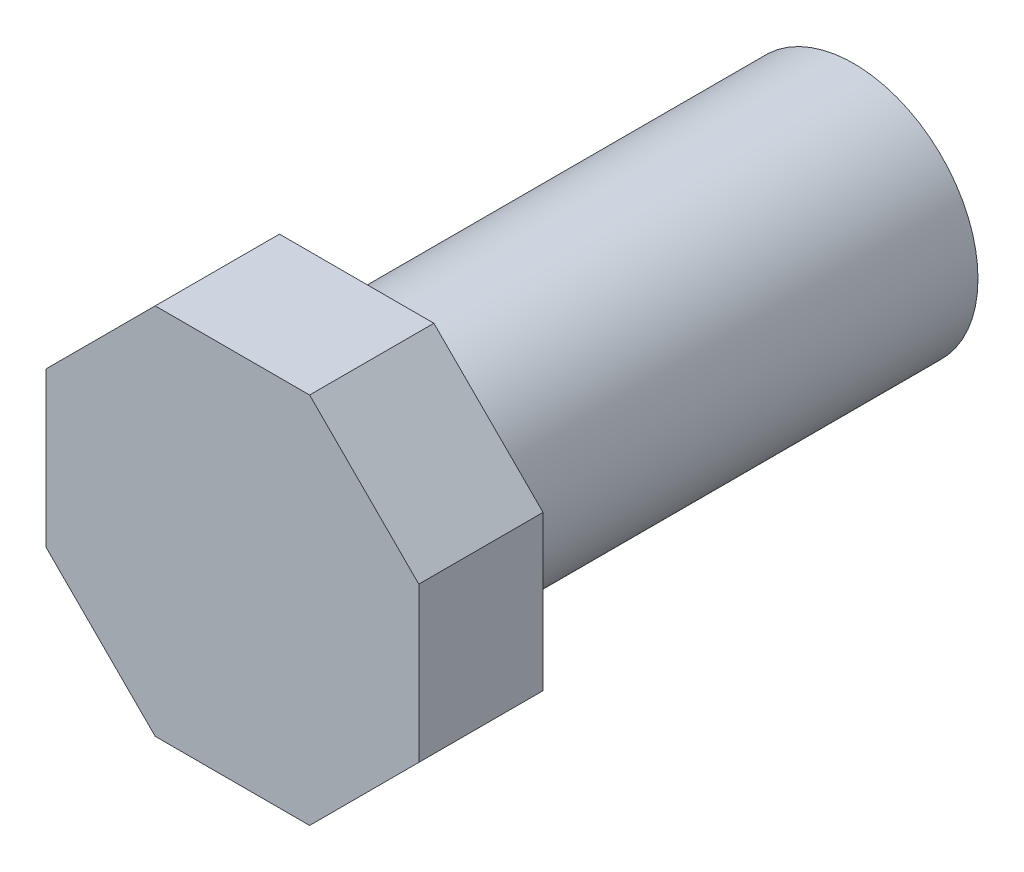
ISO-10303-21;
HEADER;
FILE_DESCRIPTION(('STEP AP214'),'2;1');
FILE_NAME('part.step','',(''),(''),'','','');
FILE_SCHEMA(('AUTOMOTIVE_DESIGN { 1 0 10303 214 1 1 1 1 }'));
ENDSEC;
DATA;
#1=APPLICATION_CONTEXT('core data for automotive mechanical design processes');
#2=APPLICATION_PROTOCOL_DEFINITION('international standard','automotive_design',2000,#1);
#3=PRODUCT_CONTEXT('',#1,'mechanical');
#4=PRODUCT('Part','Part','',(#3));
#5=PRODUCT_RELATED_PRODUCT_CATEGORY('part','',(#4));
#6=PRODUCT_DEFINITION_FORMATION('','',#4);
#7=PRODUCT_DEFINITION_CONTEXT('part definition',#1,'design');
#8=PRODUCT_DEFINITION('design','',#6,#7);
#9=PRODUCT_DEFINITION_SHAPE('','',#8);
#10=(LENGTH_UNIT() NAMED_UNIT(*) SI_UNIT(.MILLI.,.METRE.));
#11=(NAMED_UNIT(*) PLANE_ANGLE_UNIT() SI_UNIT($,.RADIAN.));
#12=(NAMED_UNIT(*) SI_UNIT($,.STERADIAN.) SOLID_ANGLE_UNIT());
#13=UNCERTAINTY_MEASURE_WITH_UNIT(LENGTH_MEASURE(1.E-05),#10,'distance_accuracy_value','');
#14=(GEOMETRIC_REPRESENTATION_CONTEXT(3) GLOBAL_UNCERTAINTY_ASSIGNED_CONTEXT((#13)) GLOBAL_UNIT_ASSIGNED_CONTEXT((#10,
#11,#12)) REPRESENTATION_CONTEXT('',''));
#15=CARTESIAN_POINT('',(0.,0.,0.));
#16=DIRECTION('',(0.,0.,1.));
#17=DIRECTION('',(1.,0.,0.));
#18=AXIS2_PLACEMENT_3D('',#15,#16,#17);
#19=CARTESIAN_POINT('',(0.,0.,25.4));
#20=DIRECTION('',(0.,0.,-1.));
#21=DIRECTION('',(-1.,0.,0.));
#22=AXIS2_PLACEMENT_3D('',#19,#20,#21);
#23=CYLINDRICAL_SURFACE('',#22,6.35);
#24=CARTESIAN_POINT('',(0.,0.,25.4));
#25=DIRECTION('',(0.,0.,1.));
#26=DIRECTION('',(1.,0.,0.));
#27=AXIS2_PLACEMENT_3D('',#24,#25,#26);
#28=CIRCLE('',#27,6.35);
#29=CARTESIAN_POINT('',(6.35,0.,25.4));
#30=VERTEX_POINT('',#29);
#31=EDGE_CURVE('E11',#30,#30,#28,.T.);
#32=ORIENTED_EDGE('',*,*,#31,.F.);
#33=EDGE_LOOP('',(#32));
#34=FACE_BOUND('',#33,.T.);
#35=CARTESIAN_POINT('',(0.,0.,0.));
#36=DIRECTION('',(0.,0.,1.));
#37=DIRECTION('',(1.,0.,0.));
#38=AXIS2_PLACEMENT_3D('',#35,#36,#37);
#39=CIRCLE('',#38,6.35);
#40=CARTESIAN_POINT('',(6.35,0.,0.));
#41=VERTEX_POINT('',#40);
#42=EDGE_CURVE('E34',#41,#41,#39,.T.);
#43=ORIENTED_EDGE('',*,*,#42,.T.);
#44=EDGE_LOOP('',(#43));
#45=FACE_BOUND('',#44,.T.);
#46=ADVANCED_FACE('F31',(#34,#45),#23,.T.);
#47=CARTESIAN_POINT('',(0.,0.,0.));
#48=DIRECTION('',(0.,0.,1.));
#49=DIRECTION('',(1.,0.,0.));
#50=AXIS2_PLACEMENT_3D('',#47,#48,#49);
#51=PLANE('',#50);
#52=ORIENTED_EDGE('',*,*,#42,.F.);
#53=EDGE_LOOP('',(#52));
#54=FACE_BOUND('',#53,.T.);
#55=ADVANCED_FACE('F161',(#54),#51,.F.);
#56=CARTESIAN_POINT('',(9.525,9.525,25.4));
#57=DIRECTION('',(0.,0.,1.));
#58=DIRECTION('',(1.,0.,0.));
#59=AXIS2_PLACEMENT_3D('',#56,#57,#58);
#60=PLANE('',#59);
#61=DIRECTION('',(0.,1.,0.));
#62=VECTOR('',#61,1.);
#63=CARTESIAN_POINT('',(9.525,-3.94538418160373,25.4));
#64=LINE('',#63,#62);
#65=CARTESIAN_POINT('',(9.525,-3.94538418160373,25.4));
#66=VERTEX_POINT('',#65);
#67=CARTESIAN_POINT('',(9.525,3.94538418160373,25.4));
#68=VERTEX_POINT('',#67);
#69=EDGE_CURVE('E128',#66,#68,#64,.T.);
#70=ORIENTED_EDGE('',*,*,#69,.F.);
#71=DIRECTION('',(0.707106781186548,0.707106781186547,0.));
#72=VECTOR('',#71,1.);
#73=CARTESIAN_POINT('',(3.94538418160373,-9.525,25.4));
#74=LINE('',#73,#72);
#75=CARTESIAN_POINT('',(3.94538418160373,-9.525,25.4));
#76=VERTEX_POINT('',#75);
#77=EDGE_CURVE('E82',#76,#66,#74,.T.);
#78=ORIENTED_EDGE('',*,*,#77,.F.);
#79=DIRECTION('',(1.,0.,0.));
#80=VECTOR('',#79,1.);
#81=CARTESIAN_POINT('',(-3.94538418160373,-9.525,25.4));
#82=LINE('',#81,#80);
#83=CARTESIAN_POINT('',(-3.94538418160373,-9.525,25.4));
#84=VERTEX_POINT('',#83);
#85=EDGE_CURVE('E76',#84,#76,#82,.T.);
#86=ORIENTED_EDGE('',*,*,#85,.F.);
#87=DIRECTION('',(0.707106781186548,-0.707106781186547,0.));
#88=VECTOR('',#87,1.);
#89=CARTESIAN_POINT('',(-9.525,-3.94538418160373,25.4));
#90=LINE('',#89,#88);
#91=CARTESIAN_POINT('',(-9.525,-3.94538418160373,25.4));
#92=VERTEX_POINT('',#91);
#93=EDGE_CURVE('E118',#92,#84,#90,.T.);
#94=ORIENTED_EDGE('',*,*,#93,.F.);
#95=DIRECTION('',(0.,-1.,0.));
#96=VECTOR('',#95,1.);
#97=CARTESIAN_POINT('',(-9.525,3.94538418160373,25.4));
#98=LINE('',#97,#96);
#99=CARTESIAN_POINT('',(-9.525,3.94538418160373,25.4));
#100=VERTEX_POINT('',#99);
#101=EDGE_CURVE('E137',#100,#92,#98,.T.);
#102=ORIENTED_EDGE('',*,*,#101,.F.);
#103=DIRECTION('',(-0.707106781186547,-0.707106781186548,0.));
#104=VECTOR('',#103,1.);
#105=CARTESIAN_POINT('',(-3.94538418160373,9.525,25.4));
#106=LINE('',#105,#104);
#107=CARTESIAN_POINT('',(-3.94538418160373,9.525,25.4));
#108=VERTEX_POINT('',#107);
#109=EDGE_CURVE('E135',#108,#100,#106,.T.);
#110=ORIENTED_EDGE('',*,*,#109,.F.);
#111=DIRECTION('',(-1.,0.,0.));
#112=VECTOR('',#111,1.);
#113=CARTESIAN_POINT('',(3.94538418160373,9.525,25.4));
#114=LINE('',#113,#112);
#115=CARTESIAN_POINT('',(3.94538418160373,9.525,25.4));
#116=VERTEX_POINT('',#115);
#117=EDGE_CURVE('E133',#116,#108,#114,.T.);
#118=ORIENTED_EDGE('',*,*,#117,.F.);
#119=DIRECTION('',(-0.707106781186548,0.707106781186547,0.));
#120=VECTOR('',#119,1.);
#121=CARTESIAN_POINT('',(9.525,3.94538418160373,25.4));
#122=LINE('',#121,#120);
#123=EDGE_CURVE('E131',#68,#116,#122,.T.);
#124=ORIENTED_EDGE('',*,*,#123,.F.);
#125=EDGE_LOOP('',(#70,#78,#86,#94,#102,#110,#118,#124));
#126=FACE_BOUND('',#125,.T.);
#127=ORIENTED_EDGE('',*,*,#31,.T.);
#128=EDGE_LOOP('',(#127));
#129=FACE_BOUND('',#128,.T.);
#130=ADVANCED_FACE('F163',(#126,#129),#60,.F.);
#131=CARTESIAN_POINT('',(9.525,-3.94538418160373,31.75));
#132=DIRECTION('',(-1.,0.,0.));
#133=DIRECTION('',(0.,0.,1.));
#134=AXIS2_PLACEMENT_3D('',#131,#132,#133);
#135=PLANE('',#134);
#136=ORIENTED_EDGE('',*,*,#69,.T.);
#137=DIRECTION('',(0.,0.,-1.));
#138=VECTOR('',#137,1.);
#139=CARTESIAN_POINT('',(9.525,3.94538418160373,31.75));
#140=LINE('',#139,#138);
#141=CARTESIAN_POINT('',(9.525,3.94538418160373,31.75));
#142=VERTEX_POINT('',#141);
#143=EDGE_CURVE('E155',#142,#68,#140,.T.);
#144=ORIENTED_EDGE('',*,*,#143,.F.);
#145=DIRECTION('',(0.,1.,0.));
#146=VECTOR('',#145,1.);
#147=CARTESIAN_POINT('',(9.525,-3.94538418160373,31.75));
#148=LINE('',#147,#146);
#149=CARTESIAN_POINT('',(9.525,-3.94538418160373,31.75));
#150=VERTEX_POINT('',#149);
#151=EDGE_CURVE('E142',#150,#142,#148,.T.);
#152=ORIENTED_EDGE('',*,*,#151,.F.);
#153=DIRECTION('',(0.,0.,-1.));
#154=VECTOR('',#153,1.);
#155=CARTESIAN_POINT('',(9.525,-3.94538418160373,31.75));
#156=LINE('',#155,#154);
#157=EDGE_CURVE('E124',#150,#66,#156,.T.);
#158=ORIENTED_EDGE('',*,*,#157,.T.);
#159=EDGE_LOOP('',(#136,#144,#152,#158));
#160=FACE_BOUND('',#159,.T.);
#161=ADVANCED_FACE('F168',(#160),#135,.F.);
#162=CARTESIAN_POINT('',(9.525,3.94538418160373,31.75));
#163=DIRECTION('',(-0.707106781186547,-0.707106781186548,0.));
#164=DIRECTION('',(0.707106781186548,-0.707106781186547,0.));
#165=AXIS2_PLACEMENT_3D('',#162,#163,#164);
#166=PLANE('',#165);
#167=ORIENTED_EDGE('',*,*,#123,.T.);
#168=DIRECTION('',(0.,0.,-1.));
#169=VECTOR('',#168,1.);
#170=CARTESIAN_POINT('',(3.94538418160373,9.525,31.75));
#171=LINE('',#170,#169);
#172=CARTESIAN_POINT('',(3.94538418160373,9.525,31.75));
#173=VERTEX_POINT('',#172);
#174=EDGE_CURVE('E152',#173,#116,#171,.T.);
#175=ORIENTED_EDGE('',*,*,#174,.F.);
#176=DIRECTION('',(-0.707106781186548,0.707106781186547,0.));
#177=VECTOR('',#176,1.);
#178=CARTESIAN_POINT('',(9.525,3.94538418160373,31.75));
#179=LINE('',#178,#177);
#180=EDGE_CURVE('E91',#142,#173,#179,.T.);
#181=ORIENTED_EDGE('',*,*,#180,.F.);
#182=ORIENTED_EDGE('',*,*,#143,.T.);
#183=EDGE_LOOP('',(#167,#175,#181,#182));
#184=FACE_BOUND('',#183,.T.);
#185=ADVANCED_FACE('F175',(#184),#166,.F.);
#186=CARTESIAN_POINT('',(3.94538418160373,9.525,31.75));
#187=DIRECTION('',(0.,-1.,0.));
#188=DIRECTION('',(0.,0.,-1.));
#189=AXIS2_PLACEMENT_3D('',#186,#187,#188);
#190=PLANE('',#189);
#191=ORIENTED_EDGE('',*,*,#117,.T.);
#192=DIRECTION('',(0.,0.,-1.));
#193=VECTOR('',#192,1.);
#194=CARTESIAN_POINT('',(-3.94538418160373,9.525,31.75));
#195=LINE('',#194,#193);
#196=CARTESIAN_POINT('',(-3.94538418160373,9.525,31.75));
#197=VERTEX_POINT('',#196);
#198=EDGE_CURVE('E149',#197,#108,#195,.T.);
#199=ORIENTED_EDGE('',*,*,#198,.F.);
#200=DIRECTION('',(-1.,0.,0.));
#201=VECTOR('',#200,1.);
#202=CARTESIAN_POINT('',(3.94538418160373,9.525,31.75));
#203=LINE('',#202,#201);
#204=EDGE_CURVE('E277',#173,#197,#203,.T.);
#205=ORIENTED_EDGE('',*,*,#204,.F.);
#206=ORIENTED_EDGE('',*,*,#174,.T.);
#207=EDGE_LOOP('',(#191,#199,#205,#206));
#208=FACE_BOUND('',#207,.T.);
#209=ADVANCED_FACE('F179',(#208),#190,.F.);
#210=CARTESIAN_POINT('',(-3.94538418160373,9.525,31.75));
#211=DIRECTION('',(0.707106781186548,-0.707106781186547,0.));
#212=DIRECTION('',(0.707106781186547,0.707106781186548,0.));
#213=AXIS2_PLACEMENT_3D('',#210,#211,#212);
#214=PLANE('',#213);
#215=ORIENTED_EDGE('',*,*,#109,.T.);
#216=DIRECTION('',(0.,0.,-1.));
#217=VECTOR('',#216,1.);
#218=CARTESIAN_POINT('',(-9.525,3.94538418160373,31.75));
#219=LINE('',#218,#217);
#220=CARTESIAN_POINT('',(-9.525,3.94538418160373,31.75));
#221=VERTEX_POINT('',#220);
#222=EDGE_CURVE('E146',#221,#100,#219,.T.);
#223=ORIENTED_EDGE('',*,*,#222,.F.);
#224=DIRECTION('',(-0.707106781186547,-0.707106781186548,0.));
#225=VECTOR('',#224,1.);
#226=CARTESIAN_POINT('',(-3.94538418160373,9.525,31.75));
#227=LINE('',#226,#225);
#228=EDGE_CURVE('E281',#197,#221,#227,.T.);
#229=ORIENTED_EDGE('',*,*,#228,.F.);
#230=ORIENTED_EDGE('',*,*,#198,.T.);
#231=EDGE_LOOP('',(#215,#223,#229,#230));
#232=FACE_BOUND('',#231,.T.);
#233=ADVANCED_FACE('F182',(#232),#214,.F.);
#234=CARTESIAN_POINT('',(-9.525,3.94538418160373,31.75));
#235=DIRECTION('',(1.,0.,0.));
#236=DIRECTION('',(0.,1.,0.));
#237=AXIS2_PLACEMENT_3D('',#234,#235,#236);
#238=PLANE('',#237);
#239=ORIENTED_EDGE('',*,*,#101,.T.);
#240=DIRECTION('',(0.,0.,-1.));
#241=VECTOR('',#240,1.);
#242=CARTESIAN_POINT('',(-9.525,-3.94538418160373,31.75));
#243=LINE('',#242,#241);
#244=CARTESIAN_POINT('',(-9.525,-3.94538418160373,31.75));
#245=VERTEX_POINT('',#244);
#246=EDGE_CURVE('E119',#245,#92,#243,.T.);
#247=ORIENTED_EDGE('',*,*,#246,.F.);
#248=DIRECTION('',(0.,-1.,0.));
#249=VECTOR('',#248,1.);
#250=CARTESIAN_POINT('',(-9.525,3.94538418160373,31.75));
#251=LINE('',#250,#249);
#252=EDGE_CURVE('E110',#221,#245,#251,.T.);
#253=ORIENTED_EDGE('',*,*,#252,.F.);
#254=ORIENTED_EDGE('',*,*,#222,.T.);
#255=EDGE_LOOP('',(#239,#247,#253,#254));
#256=FACE_BOUND('',#255,.T.);
#257=ADVANCED_FACE('F186',(#256),#238,.F.);
#258=CARTESIAN_POINT('',(-9.525,-3.94538418160373,31.75));
#259=DIRECTION('',(0.707106781186547,0.707106781186548,0.));
#260=DIRECTION('',(-0.707106781186548,0.707106781186547,0.));
#261=AXIS2_PLACEMENT_3D('',#258,#259,#260);
#262=PLANE('',#261);
#263=ORIENTED_EDGE('',*,*,#93,.T.);
#264=DIRECTION('',(0.,0.,-1.));
#265=VECTOR('',#264,1.);
#266=CARTESIAN_POINT('',(-3.94538418160373,-9.525,31.75));
#267=LINE('',#266,#265);
#268=CARTESIAN_POINT('',(-3.94538418160373,-9.525,31.75));
#269=VERTEX_POINT('',#268);
#270=EDGE_CURVE('E115',#269,#84,#267,.T.);
#271=ORIENTED_EDGE('',*,*,#270,.F.);
#272=DIRECTION('',(0.707106781186548,-0.707106781186547,0.));
#273=VECTOR('',#272,1.);
#274=CARTESIAN_POINT('',(-9.525,-3.94538418160373,31.75));
#275=LINE('',#274,#273);
#276=EDGE_CURVE('E104',#245,#269,#275,.T.);
#277=ORIENTED_EDGE('',*,*,#276,.F.);
#278=ORIENTED_EDGE('',*,*,#246,.T.);
#279=EDGE_LOOP('',(#263,#271,#277,#278));
#280=FACE_BOUND('',#279,.T.);
#281=ADVANCED_FACE('F116',(#280),#262,.F.);
#282=CARTESIAN_POINT('',(-3.94538418160373,-9.525,31.75));
#283=DIRECTION('',(0.,1.,0.));
#284=DIRECTION('',(-1.,0.,0.));
#285=AXIS2_PLACEMENT_3D('',#282,#283,#284);
#286=PLANE('',#285);
#287=ORIENTED_EDGE('',*,*,#85,.T.);
#288=DIRECTION('',(0.,0.,-1.));
#289=VECTOR('',#288,1.);
#290=CARTESIAN_POINT('',(3.94538418160373,-9.525,31.75));
#291=LINE('',#290,#289);
#292=CARTESIAN_POINT('',(3.94538418160373,-9.525,31.75));
#293=VERTEX_POINT('',#292);
#294=EDGE_CURVE('E120',#293,#76,#291,.T.);
#295=ORIENTED_EDGE('',*,*,#294,.F.);
#296=DIRECTION('',(1.,0.,0.));
#297=VECTOR('',#296,1.);
#298=CARTESIAN_POINT('',(-3.94538418160373,-9.525,31.75));
#299=LINE('',#298,#297);
#300=EDGE_CURVE('E108',#269,#293,#299,.T.);
#301=ORIENTED_EDGE('',*,*,#300,.F.);
#302=ORIENTED_EDGE('',*,*,#270,.T.);
#303=EDGE_LOOP('',(#287,#295,#301,#302));
#304=FACE_BOUND('',#303,.T.);
#305=ADVANCED_FACE('F122',(#304),#286,.F.);
#306=CARTESIAN_POINT('',(3.94538418160373,-9.525,31.75));
#307=DIRECTION('',(-0.707106781186547,0.707106781186548,0.));
#308=DIRECTION('',(-0.707106781186548,-0.707106781186547,0.));
#309=AXIS2_PLACEMENT_3D('',#306,#307,#308);
#310=PLANE('',#309);
#311=ORIENTED_EDGE('',*,*,#77,.T.);
#312=ORIENTED_EDGE('',*,*,#157,.F.);
#313=DIRECTION('',(0.707106781186548,0.707106781186547,0.));
#314=VECTOR('',#313,1.);
#315=CARTESIAN_POINT('',(3.94538418160373,-9.525,31.75));
#316=LINE('',#315,#314);
#317=EDGE_CURVE('E47',#293,#150,#316,.T.);
#318=ORIENTED_EDGE('',*,*,#317,.F.);
#319=ORIENTED_EDGE('',*,*,#294,.T.);
#320=EDGE_LOOP('',(#311,#312,#318,#319));
#321=FACE_BOUND('',#320,.T.);
#322=ADVANCED_FACE('F195',(#321),#310,.F.);
#323=CARTESIAN_POINT('',(9.525,9.525,31.75));
#324=DIRECTION('',(0.,0.,1.));
#325=DIRECTION('',(1.,0.,0.));
#326=AXIS2_PLACEMENT_3D('',#323,#324,#325);
#327=PLANE('',#326);
#328=ORIENTED_EDGE('',*,*,#151,.T.);
#329=ORIENTED_EDGE('',*,*,#180,.T.);
#330=ORIENTED_EDGE('',*,*,#204,.T.);
#331=ORIENTED_EDGE('',*,*,#228,.T.);
#332=ORIENTED_EDGE('',*,*,#252,.T.);
#333=ORIENTED_EDGE('',*,*,#276,.T.);
#334=ORIENTED_EDGE('',*,*,#300,.T.);
#335=ORIENTED_EDGE('',*,*,#317,.T.);
#336=EDGE_LOOP('',(#328,#329,#330,#331,#332,#333,#334,#335));
#337=FACE_BOUND('',#336,.T.);
#338=ADVANCED_FACE('F106',(#337),#327,.T.);
#339=CLOSED_SHELL('',(#46,#55,#130,#161,#185,#209,#233,#257,#281,#305,#322,#338));
#340=MANIFOLD_SOLID_BREP('B2',#339);
#341=ADVANCED_BREP_SHAPE_REPRESENTATION('',(#18,#340),#14);
#342=SHAPE_DEFINITION_REPRESENTATION(#9,#341);
ENDSEC;
END-ISO-10303-21;
